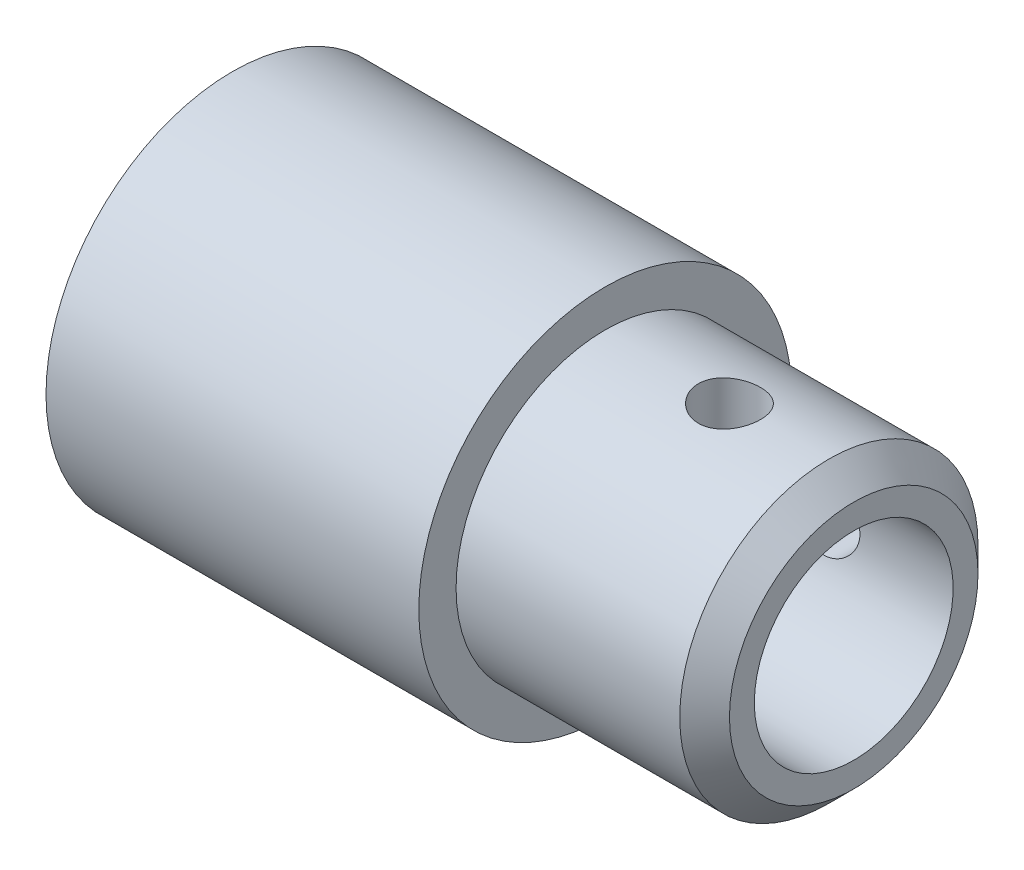
ISO-10303-21;
HEADER;
FILE_DESCRIPTION(('STEP AP214'),'2;1');
FILE_NAME('part.step','',(''),(''),'','','');
FILE_SCHEMA(('AUTOMOTIVE_DESIGN { 1 0 10303 214 1 1 1 1 }'));
ENDSEC;
DATA;
#1=APPLICATION_CONTEXT('core data for automotive mechanical design processes');
#2=APPLICATION_PROTOCOL_DEFINITION('international standard','automotive_design',2000,#1);
#3=PRODUCT_CONTEXT('',#1,'mechanical');
#4=PRODUCT('Part','Part','',(#3));
#5=PRODUCT_RELATED_PRODUCT_CATEGORY('part','',(#4));
#6=PRODUCT_DEFINITION_FORMATION('','',#4);
#7=PRODUCT_DEFINITION_CONTEXT('part definition',#1,'design');
#8=PRODUCT_DEFINITION('design','',#6,#7);
#9=PRODUCT_DEFINITION_SHAPE('','',#8);
#10=(LENGTH_UNIT() NAMED_UNIT(*) SI_UNIT(.MILLI.,.METRE.));
#11=(NAMED_UNIT(*) PLANE_ANGLE_UNIT() SI_UNIT($,.RADIAN.));
#12=(NAMED_UNIT(*) SI_UNIT($,.STERADIAN.) SOLID_ANGLE_UNIT());
#13=UNCERTAINTY_MEASURE_WITH_UNIT(LENGTH_MEASURE(1.E-05),#10,'distance_accuracy_value','');
#14=(GEOMETRIC_REPRESENTATION_CONTEXT(3) GLOBAL_UNCERTAINTY_ASSIGNED_CONTEXT((#13)) GLOBAL_UNIT_ASSIGNED_CONTEXT((#10,
#11,#12)) REPRESENTATION_CONTEXT('',''));
#15=CARTESIAN_POINT('',(0.,0.,0.));
#16=DIRECTION('',(0.,0.,1.));
#17=DIRECTION('',(1.,0.,0.));
#18=AXIS2_PLACEMENT_3D('',#15,#16,#17);
#19=CARTESIAN_POINT('',(0.,0.,0.));
#20=DIRECTION('',(-1.,0.,0.));
#21=DIRECTION('',(0.,0.,1.));
#22=AXIS2_PLACEMENT_3D('',#19,#20,#21);
#23=CYLINDRICAL_SURFACE('',#22,6.);
#24=CARTESIAN_POINT('',(24.,0.,0.));
#25=DIRECTION('',(-1.,0.,0.));
#26=DIRECTION('',(0.,0.,1.));
#27=AXIS2_PLACEMENT_3D('',#24,#25,#26);
#28=CIRCLE('',#27,6.);
#29=CARTESIAN_POINT('',(24.,0.,6.));
#30=VERTEX_POINT('',#29);
#31=EDGE_CURVE('E40',#30,#30,#28,.T.);
#32=ORIENTED_EDGE('',*,*,#31,.T.);
#33=EDGE_LOOP('',(#32));
#34=FACE_BOUND('',#33,.T.);
#35=CARTESIAN_POINT('',(20.,1.24999999999997,-5.86834729715276));
#36=CARTESIAN_POINT('',(19.930609384849,1.24999750877597,-5.86834869213646));
#37=CARTESIAN_POINT('',(19.8611880279848,1.24420229433945,-5.86959145924544));
#38=CARTESIAN_POINT('',(19.7243136826828,1.22119649233776,-5.87442015581798));
#39=CARTESIAN_POINT('',(19.6568622444936,1.20397715440339,-5.87800788138389));
#40=CARTESIAN_POINT('',(19.5259276271651,1.15868397507228,-5.88710292961931));
#41=CARTESIAN_POINT('',(19.4624404040082,1.1306214124893,-5.89260825706946));
#42=CARTESIAN_POINT('',(19.3410755003544,1.0644698860173,-5.90491581335742));
#43=CARTESIAN_POINT('',(19.28319759327,1.02638132735817,-5.91171798977623));
#44=CARTESIAN_POINT('',(19.1738046248465,0.940636399466058,-5.92596934661468));
#45=CARTESIAN_POINT('',(19.1223881063735,0.892855554869644,-5.93342614373039));
#46=CARTESIAN_POINT('',(19.0282389313519,0.789351223880613,-5.94807966802576));
#47=CARTESIAN_POINT('',(18.9855069117086,0.73362715545598,-5.95527637609915));
#48=CARTESIAN_POINT('',(18.9095541119171,0.615162052999567,-5.96868135118849));
#49=CARTESIAN_POINT('',(18.8764274735367,0.55235942820492,-5.97487958631243));
#50=CARTESIAN_POINT('',(18.8212339471402,0.421928551006699,-5.98550347343303));
#51=CARTESIAN_POINT('',(18.7991659348465,0.354300789950571,-5.98992930561223));
#52=CARTESIAN_POINT('',(18.7670242388825,0.217162904200482,-5.99645589892179));
#53=CARTESIAN_POINT('',(18.7567839828048,0.147693380916338,-5.99858891959926));
#54=CARTESIAN_POINT('',(18.748068304243,0.00799184883950599,-6.00040112580612));
#55=CARTESIAN_POINT('',(18.7495916558069,-0.0622400797368566,-6.0000805670369));
#56=CARTESIAN_POINT('',(18.7642346009568,-0.200326586199589,-5.99704658090511));
#57=CARTESIAN_POINT('',(18.7771747189581,-0.268201128726493,-5.99437018956584));
#58=CARTESIAN_POINT('',(18.8139986253313,-0.400793746289769,-5.98696720898885));
#59=CARTESIAN_POINT('',(18.8378828772031,-0.465511687511038,-5.98224053291904));
#60=CARTESIAN_POINT('',(18.8960800521255,-0.590460005384699,-5.97120767323923));
#61=CARTESIAN_POINT('',(18.9304622942097,-0.650657134981665,-5.96489104125346));
#62=CARTESIAN_POINT('',(19.0086280028404,-0.764493456510663,-5.95137300440188));
#63=CARTESIAN_POINT('',(19.0524126382061,-0.818131831816433,-5.94417148958324));
#64=CARTESIAN_POINT('',(19.1491216248911,-0.918394203276926,-5.92951700233276));
#65=CARTESIAN_POINT('',(19.2022030599819,-0.964866487494808,-5.92206184975925));
#66=CARTESIAN_POINT('',(19.3154820489948,-1.04827597240489,-5.90786872648995));
#67=CARTESIAN_POINT('',(19.3756797613872,-1.08521296069981,-5.9011307717716));
#68=CARTESIAN_POINT('',(19.5017122548288,-1.14856217138456,-5.88912998409155));
#69=CARTESIAN_POINT('',(19.5675606506934,-1.17494805489729,-5.88387085232125));
#70=CARTESIAN_POINT('',(19.7028916193694,-1.21623577538674,-5.8754760641036));
#71=CARTESIAN_POINT('',(19.7723736728081,-1.2311392488235,-5.87234010507182));
#72=CARTESIAN_POINT('',(19.9116197063189,-1.24880863867019,-5.86860783239132));
#73=CARTESIAN_POINT('',(19.981354584537,-1.25179442918,-5.86796551863474));
#74=CARTESIAN_POINT('',(20.1203258115401,-1.24613693439296,-5.86916952018703));
#75=CARTESIAN_POINT('',(20.1895621909023,-1.23749436857864,-5.87101568152623));
#76=CARTESIAN_POINT('',(20.3248205160581,-1.20901558325485,-5.87694538226166));
#77=CARTESIAN_POINT('',(20.3908686671788,-1.18929841376873,-5.88100511282997));
#78=CARTESIAN_POINT('',(20.5187239894416,-1.13935810860921,-5.8908833850312));
#79=CARTESIAN_POINT('',(20.5805307856504,-1.10913404556148,-5.89670208191057));
#80=CARTESIAN_POINT('',(20.6991064412162,-1.03854598181486,-5.90954501937191));
#81=CARTESIAN_POINT('',(20.7557922044662,-0.99804532735398,-5.91658506648323));
#82=CARTESIAN_POINT('',(20.8616432491551,-0.908234440569897,-5.93103483993907));
#83=CARTESIAN_POINT('',(20.9108076862392,-0.85892322050519,-5.93844460766531));
#84=CARTESIAN_POINT('',(21.0010627130972,-0.751900450843357,-5.95294924316736));
#85=CARTESIAN_POINT('',(21.0420040950264,-0.69406190761457,-5.9600367471991));
#86=CARTESIAN_POINT('',(21.113588752088,-0.57220010221638,-5.97296708772406));
#87=CARTESIAN_POINT('',(21.1442324822374,-0.508177113476903,-5.97880997920818));
#88=CARTESIAN_POINT('',(21.1941386793173,-0.376142117847941,-5.98856148270678));
#89=CARTESIAN_POINT('',(21.2134691655443,-0.308156710970217,-5.99248163136497));
#90=CARTESIAN_POINT('',(21.2404144040081,-0.169813400503495,-5.99799561410226));
#91=CARTESIAN_POINT('',(21.2480306935327,-0.0994558094617174,-5.99958975342889));
#92=CARTESIAN_POINT('',(21.2512676220485,0.0402133434703167,-6.00026408056941));
#93=CARTESIAN_POINT('',(21.2471118999947,0.109519592177899,-5.99939113754811));
#94=CARTESIAN_POINT('',(21.2274193613471,0.246422870373528,-5.99532874094472));
#95=CARTESIAN_POINT('',(21.2118827135932,0.314019925202678,-5.99213932172839));
#96=CARTESIAN_POINT('',(21.1699722053514,0.445431965492027,-5.98380460077544));
#97=CARTESIAN_POINT('',(21.1436273361469,0.509256550004498,-5.97866453407556));
#98=CARTESIAN_POINT('',(21.080877602268,0.631610567220716,-5.96697995347705));
#99=CARTESIAN_POINT('',(21.0444718616569,0.690139538279485,-5.96043531730246));
#100=CARTESIAN_POINT('',(20.9618903320067,0.801340321298234,-5.94651596786387));
#101=CARTESIAN_POINT('',(20.9155557119433,0.853892633615899,-5.93912880302851));
#102=CARTESIAN_POINT('',(20.8147554990029,0.950552741980358,-5.9244278681135));
#103=CARTESIAN_POINT('',(20.7602879700516,0.994658521571205,-5.91711411595369));
#104=CARTESIAN_POINT('',(20.6439908975666,1.07367451852764,-5.90329191643328));
#105=CARTESIAN_POINT('',(20.5820815885379,1.10846928126991,-5.89679406702551));
#106=CARTESIAN_POINT('',(20.4531748439167,1.16710627925303,-5.88547039658063));
#107=CARTESIAN_POINT('',(20.386181951547,1.19095816292457,-5.88064310352601));
#108=CARTESIAN_POINT('',(20.2658937184316,1.22256554131858,-5.87414004405196));
#109=CARTESIAN_POINT('',(20.2132704634069,1.23283449005668,-5.87198163591589));
#110=CARTESIAN_POINT('',(20.107104219479,1.24655254358401,-5.86908475266778));
#111=CARTESIAN_POINT('',(20.05356126769,1.25000192292738,-5.86834622039194));
#112=CARTESIAN_POINT('',(20.,1.24999999999997,-5.86834729715276));
#113=B_SPLINE_CURVE_WITH_KNOTS('',3,(#35,#36,#37,#38,#39,#40,#41,#42,#43,#44,#45,#46,#47,#48,
#49,#50,#51,#52,#53,#54,#55,#56,#57,#58,#59,#60,#61,#62,#63,#64,#65,#66,#67,#68,#69,#70,#71,#72,
#73,#74,#75,#76,#77,#78,#79,#80,#81,#82,#83,#84,#85,#86,#87,#88,#89,#90,#91,#92,#93,#94,#95,#96,
#97,#98,#99,#100,#101,#102,#103,#104,#105,#106,#107,#108,#109,#110,#111,#112),.UNSPECIFIED.,.T.,
.F.,(4,2,2,2,2,2,2,2,2,2,2,2,2,2,2,2,2,2,2,2,2,2,2,2,2,2,2,2,2,2,2,2,2,2,2,2,2,2,4),(0.,
0.207975654071266,0.416110792417466,0.624030014802723,0.831940834815785,1.04271333467884,
1.25350128663873,1.46629026266843,1.67905760106932,1.88879048859263,2.09850151896337,
2.3049734141646,2.51145405455869,2.71932871977947,2.92722924104258,3.13905862244911,
3.35089272191626,3.56325237332485,3.77558175387594,3.98397516009789,4.19235567296521,
4.3985378623192,4.60473825464028,4.81383917934648,5.02296356082183,5.2355945875334,
5.44821621759037,5.65954599648531,5.87084803959578,6.07816293922641,6.28547476332978,
6.49223410585097,6.69901145528169,6.90938318978569,7.11980508427531,7.33272651358119,
7.54545984571984,7.70599867585765,7.86653104261156),.UNSPECIFIED.);
#114=CARTESIAN_POINT('',(20.,1.24999999999997,-5.86834729715276));
#115=VERTEX_POINT('',#114);
#116=EDGE_CURVE('E113',#115,#115,#113,.T.);
#117=ORIENTED_EDGE('',*,*,#116,.T.);
#118=EDGE_LOOP('',(#117));
#119=FACE_BOUND('',#118,.T.);
#120=CARTESIAN_POINT('',(20.,5.86834729715275,1.24999999999999));
#121=CARTESIAN_POINT('',(19.930609384849,5.86834869213646,1.24999750877599));
#122=CARTESIAN_POINT('',(19.8611880279848,5.86959145924544,1.24420229433947));
#123=CARTESIAN_POINT('',(19.7243136826828,5.87442015581798,1.22119649233778));
#124=CARTESIAN_POINT('',(19.6568622444936,5.87800788138388,1.20397715440341));
#125=CARTESIAN_POINT('',(19.5259276271651,5.8871029296193,1.1586839750723));
#126=CARTESIAN_POINT('',(19.4624404040082,5.89260825706945,1.13062141248932));
#127=CARTESIAN_POINT('',(19.3410755003544,5.90491581335741,1.06446988601732));
#128=CARTESIAN_POINT('',(19.28319759327,5.91171798977622,1.02638132735819));
#129=CARTESIAN_POINT('',(19.1738046248465,5.92596934661468,0.940636399466079));
#130=CARTESIAN_POINT('',(19.1223881063735,5.93342614373039,0.892855554869665));
#131=CARTESIAN_POINT('',(19.0282389313519,5.94807966802575,0.789351223880634));
#132=CARTESIAN_POINT('',(18.9855069117086,5.95527637609915,0.733627155456001));
#133=CARTESIAN_POINT('',(18.9095541119171,5.96868135118848,0.615162052999588));
#134=CARTESIAN_POINT('',(18.8764274735367,5.97487958631242,0.552359428204941));
#135=CARTESIAN_POINT('',(18.8212339471402,5.98550347343302,0.42192855100672));
#136=CARTESIAN_POINT('',(18.7991659348465,5.98992930561222,0.354300789950591));
#137=CARTESIAN_POINT('',(18.7670242388825,5.99645589892179,0.217162904200503));
#138=CARTESIAN_POINT('',(18.7567839828048,5.99858891959926,0.147693380916359));
#139=CARTESIAN_POINT('',(18.748068304243,6.00040112580612,0.00799184883952699));
#140=CARTESIAN_POINT('',(18.7495916558069,6.0000805670369,-0.0622400797368356));
#141=CARTESIAN_POINT('',(18.7642346009568,5.99704658090511,-0.200326586199568));
#142=CARTESIAN_POINT('',(18.7771747189581,5.99437018956584,-0.268201128726472));
#143=CARTESIAN_POINT('',(18.8139986253313,5.98696720898885,-0.400793746289748));
#144=CARTESIAN_POINT('',(18.8378828772031,5.98224053291904,-0.465511687511017));
#145=CARTESIAN_POINT('',(18.8960800521255,5.97120767323924,-0.590460005384678));
#146=CARTESIAN_POINT('',(18.9304622942097,5.96489104125346,-0.650657134981644));
#147=CARTESIAN_POINT('',(19.0086280028404,5.95137300440189,-0.764493456510642));
#148=CARTESIAN_POINT('',(19.0524126382061,5.94417148958325,-0.818131831816412));
#149=CARTESIAN_POINT('',(19.1491216248911,5.92951700233276,-0.918394203276905));
#150=CARTESIAN_POINT('',(19.2022030599819,5.92206184975926,-0.964866487494787));
#151=CARTESIAN_POINT('',(19.3154820489948,5.90786872648996,-1.04827597240487));
#152=CARTESIAN_POINT('',(19.3756797613872,5.9011307717716,-1.08521296069979));
#153=CARTESIAN_POINT('',(19.5017122548288,5.88912998409156,-1.14856217138453));
#154=CARTESIAN_POINT('',(19.5675606506934,5.88387085232125,-1.17494805489726));
#155=CARTESIAN_POINT('',(19.7028916193694,5.8754760641036,-1.21623577538672));
#156=CARTESIAN_POINT('',(19.7723736728081,5.87234010507182,-1.23113924882348));
#157=CARTESIAN_POINT('',(19.9116197063189,5.86860783239132,-1.24880863867017));
#158=CARTESIAN_POINT('',(19.981354584537,5.86796551863474,-1.25179442917998));
#159=CARTESIAN_POINT('',(20.1203258115401,5.86916952018704,-1.24613693439294));
#160=CARTESIAN_POINT('',(20.1895621909023,5.87101568152624,-1.23749436857862));
#161=CARTESIAN_POINT('',(20.3248205160581,5.87694538226167,-1.20901558325483));
#162=CARTESIAN_POINT('',(20.3908686671788,5.88100511282998,-1.18929841376871));
#163=CARTESIAN_POINT('',(20.5187239894416,5.8908833850312,-1.13935810860919));
#164=CARTESIAN_POINT('',(20.5805307856504,5.89670208191057,-1.10913404556146));
#165=CARTESIAN_POINT('',(20.6991064412162,5.90954501937191,-1.03854598181484));
#166=CARTESIAN_POINT('',(20.7557922044662,5.91658506648323,-0.998045327353959));
#167=CARTESIAN_POINT('',(20.8616432491551,5.93103483993908,-0.908234440569876));
#168=CARTESIAN_POINT('',(20.9108076862392,5.93844460766532,-0.85892322050517));
#169=CARTESIAN_POINT('',(21.0010627130972,5.95294924316736,-0.751900450843337));
#170=CARTESIAN_POINT('',(21.0420040950264,5.9600367471991,-0.694061907614549));
#171=CARTESIAN_POINT('',(21.113588752088,5.97296708772407,-0.572200102216359));
#172=CARTESIAN_POINT('',(21.1442324822374,5.97880997920818,-0.508177113476882));
#173=CARTESIAN_POINT('',(21.1941386793173,5.98856148270679,-0.376142117847921));
#174=CARTESIAN_POINT('',(21.2134691655443,5.99248163136497,-0.308156710970196));
#175=CARTESIAN_POINT('',(21.2404144040081,5.99799561410226,-0.169813400503474));
#176=CARTESIAN_POINT('',(21.2480306935327,5.99958975342889,-0.0994558094616964));
#177=CARTESIAN_POINT('',(21.2512676220485,6.00026408056941,0.0402133434703376));
#178=CARTESIAN_POINT('',(21.2471118999947,5.99939113754811,0.10951959217792));
#179=CARTESIAN_POINT('',(21.2274193613471,5.99532874094472,0.246422870373549));
#180=CARTESIAN_POINT('',(21.2118827135932,5.99213932172839,0.314019925202699));
#181=CARTESIAN_POINT('',(21.1699722053514,5.98380460077544,0.445431965492047));
#182=CARTESIAN_POINT('',(21.1436273361469,5.97866453407556,0.509256550004518));
#183=CARTESIAN_POINT('',(21.080877602268,5.96697995347704,0.631610567220735));
#184=CARTESIAN_POINT('',(21.0444718616569,5.96043531730246,0.690139538279505));
#185=CARTESIAN_POINT('',(20.9618903320067,5.94651596786386,0.801340321298254));
#186=CARTESIAN_POINT('',(20.9155557119433,5.93912880302851,0.85389263361592));
#187=CARTESIAN_POINT('',(20.8147554990029,5.9244278681135,0.950552741980379));
#188=CARTESIAN_POINT('',(20.7602879700516,5.91711411595368,0.994658521571226));
#189=CARTESIAN_POINT('',(20.6439908975666,5.90329191643327,1.07367451852767));
#190=CARTESIAN_POINT('',(20.5820815885379,5.89679406702551,1.10846928126993));
#191=CARTESIAN_POINT('',(20.4531748439167,5.88547039658063,1.16710627925306));
#192=CARTESIAN_POINT('',(20.386181951547,5.88064310352601,1.19095816292459));
#193=CARTESIAN_POINT('',(20.2658937184316,5.87414004405196,1.2225655413186));
#194=CARTESIAN_POINT('',(20.2132704634069,5.87198163591589,1.23283449005669));
#195=CARTESIAN_POINT('',(20.107104219479,5.86908475266778,1.24655254358403));
#196=CARTESIAN_POINT('',(20.05356126769,5.86834622039193,1.2500019229274));
#197=CARTESIAN_POINT('',(20.,5.86834729715275,1.24999999999999));
#198=B_SPLINE_CURVE_WITH_KNOTS('',3,(#120,#121,#122,#123,#124,#125,#126,#127,#128,#129,#130,
#131,#132,#133,#134,#135,#136,#137,#138,#139,#140,#141,#142,#143,#144,#145,#146,#147,#148,#149,
#150,#151,#152,#153,#154,#155,#156,#157,#158,#159,#160,#161,#162,#163,#164,#165,#166,#167,#168,
#169,#170,#171,#172,#173,#174,#175,#176,#177,#178,#179,#180,#181,#182,#183,#184,#185,#186,#187,
#188,#189,#190,#191,#192,#193,#194,#195,#196,#197),.UNSPECIFIED.,.T.,.F.,(4,2,2,2,2,2,2,2,2,2,2,
2,2,2,2,2,2,2,2,2,2,2,2,2,2,2,2,2,2,2,2,2,2,2,2,2,2,2,4),(0.,0.207975654071266,
0.416110792417466,0.624030014802731,0.831940834815785,1.04271333467884,1.25350128663873,
1.46629026266843,1.67905760106932,1.88879048859263,2.09850151896337,2.3049734141646,
2.51145405455869,2.71932871977947,2.92722924104258,3.13905862244911,3.35089272191626,
3.56325237332485,3.77558175387594,3.98397516009789,4.19235567296521,4.3985378623192,
4.60473825464028,4.81383917934648,5.02296356082183,5.2355945875334,5.44821621759037,
5.65954599648531,5.87084803959578,6.07816293922641,6.28547476332978,6.49223410585097,
6.69901145528169,6.90938318978569,7.11980508427531,7.33272651358119,7.54545984571984,
7.70599867585765,7.86653104261156),.UNSPECIFIED.);
#199=CARTESIAN_POINT('',(20.,5.86834729715275,1.24999999999999));
#200=VERTEX_POINT('',#199);
#201=EDGE_CURVE('E62',#200,#200,#198,.T.);
#202=ORIENTED_EDGE('',*,*,#201,.T.);
#203=EDGE_LOOP('',(#202));
#204=FACE_BOUND('',#203,.T.);
#205=CARTESIAN_POINT('',(15.,0.,0.));
#206=DIRECTION('',(-1.,0.,0.));
#207=DIRECTION('',(0.,0.,1.));
#208=AXIS2_PLACEMENT_3D('',#205,#206,#207);
#209=CIRCLE('',#208,6.);
#210=CARTESIAN_POINT('',(15.,0.,6.));
#211=VERTEX_POINT('',#210);
#212=EDGE_CURVE('E44',#211,#211,#209,.T.);
#213=ORIENTED_EDGE('',*,*,#212,.F.);
#214=EDGE_LOOP('',(#213));
#215=FACE_BOUND('',#214,.T.);
#216=ADVANCED_FACE('F33',(#34,#119,#204,#215),#23,.T.);
#217=CARTESIAN_POINT('',(0.,0.,0.));
#218=DIRECTION('',(-1.,0.,0.));
#219=DIRECTION('',(0.,0.,1.));
#220=AXIS2_PLACEMENT_3D('',#217,#218,#219);
#221=CYLINDRICAL_SURFACE('',#220,4.);
#222=CARTESIAN_POINT('',(20.,1.24999999999998,-3.79967103839267));
#223=CARTESIAN_POINT('',(20.0683470361093,1.24999953780045,-3.79967145961937));
#224=CARTESIAN_POINT('',(20.1366987687032,1.24437538791492,-3.80153531505043));
#225=CARTESIAN_POINT('',(20.2713941608778,1.22209175401325,-3.80875638998877));
#226=CARTESIAN_POINT('',(20.3377372727322,1.20542928782513,-3.81411455353137));
#227=CARTESIAN_POINT('',(20.466444901932,1.16169788223557,-3.8276593883596));
#228=CARTESIAN_POINT('',(20.5288162331057,1.13464735736675,-3.83584105194317));
#229=CARTESIAN_POINT('',(20.648152695864,1.07096914173155,-3.85410406218689));
#230=CARTESIAN_POINT('',(20.7051168699601,1.0343397590563,-3.86418574435841));
#231=CARTESIAN_POINT('',(20.8139788674935,0.951196070622273,-3.8855012766862));
#232=CARTESIAN_POINT('',(20.865663609436,0.904409399720379,-3.89676123384781));
#233=CARTESIAN_POINT('',(20.9605960132092,0.802862046455476,-3.91894245860336));
#234=CARTESIAN_POINT('',(21.0038424969448,0.748100252518547,-3.92986367872628));
#235=CARTESIAN_POINT('',(21.0816110630112,0.630625912493345,-3.95043553390078));
#236=CARTESIAN_POINT('',(21.1159137038314,0.567761556520078,-3.9600518456278));
#237=CARTESIAN_POINT('',(21.1733760498555,0.436804232853388,-3.97662551833019));
#238=CARTESIAN_POINT('',(21.1965383741496,0.368712498487036,-3.98358350419919));
#239=CARTESIAN_POINT('',(21.2303511280971,0.231464356966083,-3.99387175820863));
#240=CARTESIAN_POINT('',(21.2413657497878,0.162405715468201,-3.99730738984143));
#241=CARTESIAN_POINT('',(21.2517243464375,0.0233408139845071,-4.00053595876015));
#242=CARTESIAN_POINT('',(21.2510709743588,-0.0466652269730961,-4.00032972410065));
#243=CARTESIAN_POINT('',(21.238351708414,-0.183074480354746,-3.99637116132537));
#244=CARTESIAN_POINT('',(21.226680616487,-0.249518634314055,-3.99274150972157));
#245=CARTESIAN_POINT('',(21.192905009957,-0.379453063347781,-3.98249482560855));
#246=CARTESIAN_POINT('',(21.1707998149134,-0.442943145481206,-3.97587759827134));
#247=CARTESIAN_POINT('',(21.1165298109251,-0.566078103154791,-3.96023459729533));
#248=CARTESIAN_POINT('',(21.084245191437,-0.62566640562284,-3.95118033616957));
#249=CARTESIAN_POINT('',(21.0106289002954,-0.738702511152038,-3.93161722953562));
#250=CARTESIAN_POINT('',(20.9692949408622,-0.792148756208846,-3.92110801644584));
#251=CARTESIAN_POINT('',(20.8767263651987,-0.89373769845389,-3.89923670734646));
#252=CARTESIAN_POINT('',(20.8251509311588,-0.941566549094187,-3.88785731989084));
#253=CARTESIAN_POINT('',(20.7146048981755,-1.02798974259538,-3.86590615440412));
#254=CARTESIAN_POINT('',(20.655633429425,-1.06658299775342,-3.85533447159846));
#255=CARTESIAN_POINT('',(20.5310825311402,-1.13380465019766,-3.83610846648973));
#256=CARTESIAN_POINT('',(20.4654365909576,-1.16231680702683,-3.82747690354323));
#257=CARTESIAN_POINT('',(20.3299405081046,-1.20778345948514,-3.81337545338913));
#258=CARTESIAN_POINT('',(20.2600918857895,-1.22474210765794,-3.80790443033293));
#259=CARTESIAN_POINT('',(20.1211800474342,-1.24601485185709,-3.80099563391872));
#260=CARTESIAN_POINT('',(20.0521980037679,-1.25080954353711,-3.79940466389696));
#261=CARTESIAN_POINT('',(19.9144102585018,-1.24896744498308,-3.80001077463984));
#262=CARTESIAN_POINT('',(19.8456045312995,-1.24233242111456,-3.80220727008389));
#263=CARTESIAN_POINT('',(19.7121917033484,-1.21824873513144,-3.80998957482874));
#264=CARTESIAN_POINT('',(19.647520725926,-1.20111831160538,-3.81547554101731));
#265=CARTESIAN_POINT('',(19.521978208004,-1.15690373661028,-3.8291128733166));
#266=CARTESIAN_POINT('',(19.4611072890788,-1.12981796171155,-3.83726467412387));
#267=CARTESIAN_POINT('',(19.3429608902283,-1.06557510655875,-3.85560539653156));
#268=CARTESIAN_POINT('',(19.2858385844072,-1.02815147488558,-3.86584603489733));
#269=CARTESIAN_POINT('',(19.1785096536381,-0.944606408679819,-3.88710348972828));
#270=CARTESIAN_POINT('',(19.1283048310747,-0.898482714690792,-3.89812050735702));
#271=CARTESIAN_POINT('',(19.0340896340872,-0.796572947753613,-3.92024187562679));
#272=CARTESIAN_POINT('',(18.9904222138601,-0.740465649788529,-3.93133092285679));
#273=CARTESIAN_POINT('',(18.9131089566788,-0.621451545651407,-3.95189059843678));
#274=CARTESIAN_POINT('',(18.879462660689,-0.558545051108634,-3.96136130090946));
#275=CARTESIAN_POINT('',(18.8234694375283,-0.428105523331845,-3.97756311928512));
#276=CARTESIAN_POINT('',(18.8010407121563,-0.36061018428377,-3.984313995612));
#277=CARTESIAN_POINT('',(18.7679274614103,-0.222557254056404,-3.99440242648576));
#278=CARTESIAN_POINT('',(18.7572392609165,-0.152000628340371,-3.99774104914277));
#279=CARTESIAN_POINT('',(18.7482089982504,-0.0129849366489144,-4.00055803404462));
#280=CARTESIAN_POINT('',(18.7493715498292,0.0554391919465063,-4.0001912940739));
#281=CARTESIAN_POINT('',(18.7628118110487,0.191073221923232,-3.99600978081048));
#282=CARTESIAN_POINT('',(18.775088795992,0.258283202179552,-3.99219523232619));
#283=CARTESIAN_POINT('',(18.8100940092223,0.388755118480775,-3.98159570844796));
#284=CARTESIAN_POINT('',(18.8326896078454,0.452055918449464,-3.97484847960205));
#285=CARTESIAN_POINT('',(18.8875708272085,0.573998425500073,-3.9590794558795));
#286=CARTESIAN_POINT('',(18.9198581099734,0.632639331274464,-3.95005727091358));
#287=CARTESIAN_POINT('',(18.9944727583444,0.74576169496967,-3.93029896883376));
#288=CARTESIAN_POINT('',(19.037103522464,0.800034607053092,-3.91951509750962));
#289=CARTESIAN_POINT('',(19.1306598894435,0.900820791399299,-3.89758736547061));
#290=CARTESIAN_POINT('',(19.1815879741394,0.94733173350414,-3.88644339784827));
#291=CARTESIAN_POINT('',(19.2923157198411,1.03282865911251,-3.86461892577438));
#292=CARTESIAN_POINT('',(19.3523534031166,1.07151427994709,-3.85396600863456));
#293=CARTESIAN_POINT('',(19.4783981202691,1.1382047074852,-3.83480125279531));
#294=CARTESIAN_POINT('',(19.5444027264503,1.16621383403544,-3.82628854861387));
#295=CARTESIAN_POINT('',(19.6747226173147,1.2087118043579,-3.81306560440328));
#296=CARTESIAN_POINT('',(19.7387025474516,1.22414939837871,-3.8080931504375));
#297=CARTESIAN_POINT('',(19.8684538320965,1.24479245816098,-3.80139606482399));
#298=CARTESIAN_POINT('',(19.9342247412015,1.25000044480776,-3.79967063301599));
#299=CARTESIAN_POINT('',(20.,1.24999999999998,-3.79967103839267));
#300=B_SPLINE_CURVE_WITH_KNOTS('',3,(#222,#223,#224,#225,#226,#227,#228,#229,#230,#231,#232,
#233,#234,#235,#236,#237,#238,#239,#240,#241,#242,#243,#244,#245,#246,#247,#248,#249,#250,#251,
#252,#253,#254,#255,#256,#257,#258,#259,#260,#261,#262,#263,#264,#265,#266,#267,#268,#269,#270,
#271,#272,#273,#274,#275,#276,#277,#278,#279,#280,#281,#282,#283,#284,#285,#286,#287,#288,#289,
#290,#291,#292,#293,#294,#295,#296,#297,#298,#299),.UNSPECIFIED.,.T.,.F.,(4,2,2,2,2,2,2,2,2,2,2,
2,2,2,2,2,2,2,2,2,2,2,2,2,2,2,2,2,2,2,2,2,2,2,2,2,2,2,4),(0.,0.204798137548487,
0.409651627059732,0.614143644118576,0.818671804924944,1.02957080550838,1.24049922941122,
1.45619821963732,1.67184647417921,1.88083722835532,2.08978046471773,2.29150982969749,
2.49325235190092,2.69746404608407,2.90172742713186,3.11450338937332,3.32730439853774,
3.54248470934452,3.75758763952751,3.96404933287933,4.17047912219087,4.37093972044361,
4.57143302253207,4.77767613309608,4.98397288011877,5.19881937811508,5.41365603317083,
5.62690239290994,5.84008198140581,6.04438802439521,6.24868074692303,6.45041846514755,
6.65219079911648,6.86080693105211,7.06948557772186,7.285077955017,7.50058300803817,
7.69772354371381,7.89481549188774),.UNSPECIFIED.);
#301=CARTESIAN_POINT('',(20.,1.24999999999998,-3.79967103839267));
#302=VERTEX_POINT('',#301);
#303=EDGE_CURVE('E120',#302,#302,#300,.T.);
#304=ORIENTED_EDGE('',*,*,#303,.T.);
#305=EDGE_LOOP('',(#304));
#306=FACE_BOUND('',#305,.T.);
#307=CARTESIAN_POINT('',(20.,3.79967103839267,1.24999999999999));
#308=CARTESIAN_POINT('',(20.0683470361093,3.79967145961936,1.24999953780046));
#309=CARTESIAN_POINT('',(20.1366987687032,3.80153531505043,1.24437538791494));
#310=CARTESIAN_POINT('',(20.2713941608778,3.80875638998877,1.22209175401326));
#311=CARTESIAN_POINT('',(20.3377372727322,3.81411455353136,1.20542928782514));
#312=CARTESIAN_POINT('',(20.466444901932,3.8276593883596,1.16169788223558));
#313=CARTESIAN_POINT('',(20.5288162331057,3.83584105194317,1.13464735736676));
#314=CARTESIAN_POINT('',(20.648152695864,3.85410406218688,1.07096914173156));
#315=CARTESIAN_POINT('',(20.7051168699601,3.86418574435841,1.03433975905631));
#316=CARTESIAN_POINT('',(20.8139788674935,3.8855012766862,0.951196070622286));
#317=CARTESIAN_POINT('',(20.865663609436,3.8967612338478,0.904409399720393));
#318=CARTESIAN_POINT('',(20.9605960132092,3.91894245860336,0.80286204645549));
#319=CARTESIAN_POINT('',(21.0038424969448,3.92986367872627,0.748100252518561));
#320=CARTESIAN_POINT('',(21.0816110630112,3.95043553390078,0.630625912493359));
#321=CARTESIAN_POINT('',(21.1159137038314,3.9600518456278,0.567761556520092));
#322=CARTESIAN_POINT('',(21.1733760498555,3.97662551833019,0.436804232853402));
#323=CARTESIAN_POINT('',(21.1965383741496,3.98358350419919,0.36871249848705));
#324=CARTESIAN_POINT('',(21.2303511280971,3.99387175820862,0.231464356966097));
#325=CARTESIAN_POINT('',(21.2413657497878,3.99730738984143,0.162405715468215));
#326=CARTESIAN_POINT('',(21.2517243464375,4.00053595876015,0.0233408139845211));
#327=CARTESIAN_POINT('',(21.2510709743588,4.00032972410065,-0.0466652269730821));
#328=CARTESIAN_POINT('',(21.238351708414,3.99637116132537,-0.183074480354732));
#329=CARTESIAN_POINT('',(21.226680616487,3.99274150972157,-0.249518634314041));
#330=CARTESIAN_POINT('',(21.192905009957,3.98249482560855,-0.379453063347767));
#331=CARTESIAN_POINT('',(21.1707998149134,3.97587759827134,-0.442943145481192));
#332=CARTESIAN_POINT('',(21.1165298109251,3.96023459729533,-0.566078103154777));
#333=CARTESIAN_POINT('',(21.084245191437,3.95118033616957,-0.625666405622826));
#334=CARTESIAN_POINT('',(21.0106289002954,3.93161722953562,-0.738702511152024));
#335=CARTESIAN_POINT('',(20.9692949408622,3.92110801644584,-0.792148756208833));
#336=CARTESIAN_POINT('',(20.8767263651987,3.89923670734646,-0.893737698453876));
#337=CARTESIAN_POINT('',(20.8251509311588,3.88785731989084,-0.941566549094174));
#338=CARTESIAN_POINT('',(20.7146048981755,3.86590615440413,-1.02798974259537));
#339=CARTESIAN_POINT('',(20.655633429425,3.85533447159847,-1.06658299775341));
#340=CARTESIAN_POINT('',(20.5310825311402,3.83610846648974,-1.13380465019765));
#341=CARTESIAN_POINT('',(20.4654365909576,3.82747690354324,-1.16231680702681));
#342=CARTESIAN_POINT('',(20.3299405081046,3.81337545338913,-1.20778345948513));
#343=CARTESIAN_POINT('',(20.2600918857895,3.80790443033294,-1.22474210765793));
#344=CARTESIAN_POINT('',(20.1211800474342,3.80099563391872,-1.24601485185708));
#345=CARTESIAN_POINT('',(20.0521980037679,3.79940466389696,-1.2508095435371));
#346=CARTESIAN_POINT('',(19.9144102585018,3.80001077463985,-1.24896744498306));
#347=CARTESIAN_POINT('',(19.8456045312995,3.8022072700839,-1.24233242111455));
#348=CARTESIAN_POINT('',(19.7121917033484,3.80998957482874,-1.21824873513143));
#349=CARTESIAN_POINT('',(19.647520725926,3.81547554101732,-1.20111831160537));
#350=CARTESIAN_POINT('',(19.521978208004,3.82911287331661,-1.15690373661027));
#351=CARTESIAN_POINT('',(19.4611072890788,3.83726467412388,-1.12981796171154));
#352=CARTESIAN_POINT('',(19.3429608902283,3.85560539653156,-1.06557510655874));
#353=CARTESIAN_POINT('',(19.2858385844072,3.86584603489733,-1.02815147488557));
#354=CARTESIAN_POINT('',(19.1785096536381,3.88710348972828,-0.944606408679805));
#355=CARTESIAN_POINT('',(19.1283048310747,3.89812050735703,-0.898482714690778));
#356=CARTESIAN_POINT('',(19.0340896340872,3.92024187562679,-0.7965729477536));
#357=CARTESIAN_POINT('',(18.9904222138601,3.93133092285679,-0.740465649788515));
#358=CARTESIAN_POINT('',(18.9131089566788,3.95189059843678,-0.621451545651393));
#359=CARTESIAN_POINT('',(18.879462660689,3.96136130090946,-0.558545051108621));
#360=CARTESIAN_POINT('',(18.8234694375283,3.97756311928512,-0.428105523331831));
#361=CARTESIAN_POINT('',(18.8010407121563,3.984313995612,-0.360610184283756));
#362=CARTESIAN_POINT('',(18.7679274614103,3.99440242648576,-0.22255725405639));
#363=CARTESIAN_POINT('',(18.7572392609165,3.99774104914277,-0.152000628340357));
#364=CARTESIAN_POINT('',(18.7482089982504,4.00055803404461,-0.0129849366489005));
#365=CARTESIAN_POINT('',(18.7493715498292,4.0001912940739,0.0554391919465202));
#366=CARTESIAN_POINT('',(18.7628118110487,3.99600978081048,0.191073221923246));
#367=CARTESIAN_POINT('',(18.775088795992,3.99219523232619,0.258283202179566));
#368=CARTESIAN_POINT('',(18.8100940092223,3.98159570844796,0.388755118480788));
#369=CARTESIAN_POINT('',(18.8326896078454,3.97484847960205,0.452055918449478));
#370=CARTESIAN_POINT('',(18.8875708272085,3.9590794558795,0.573998425500087));
#371=CARTESIAN_POINT('',(18.9198581099734,3.95005727091358,0.632639331274477));
#372=CARTESIAN_POINT('',(18.9944727583444,3.93029896883376,0.745761694969684));
#373=CARTESIAN_POINT('',(19.037103522464,3.91951509750962,0.800034607053106));
#374=CARTESIAN_POINT('',(19.1306598894435,3.89758736547061,0.900820791399313));
#375=CARTESIAN_POINT('',(19.1815879741394,3.88644339784827,0.947331733504153));
#376=CARTESIAN_POINT('',(19.2923157198411,3.86461892577438,1.03282865911252));
#377=CARTESIAN_POINT('',(19.3523534031166,3.85396600863456,1.0715142799471));
#378=CARTESIAN_POINT('',(19.4783981202691,3.83480125279531,1.13820470748521));
#379=CARTESIAN_POINT('',(19.5444027264503,3.82628854861387,1.16621383403545));
#380=CARTESIAN_POINT('',(19.6747226173147,3.81306560440328,1.20871180435792));
#381=CARTESIAN_POINT('',(19.7387025474516,3.80809315043749,1.22414939837873));
#382=CARTESIAN_POINT('',(19.8684538320965,3.80139606482399,1.24479245816099));
#383=CARTESIAN_POINT('',(19.9342247412015,3.79967063301598,1.25000044480778));
#384=CARTESIAN_POINT('',(20.,3.79967103839267,1.24999999999999));
#385=B_SPLINE_CURVE_WITH_KNOTS('',3,(#307,#308,#309,#310,#311,#312,#313,#314,#315,#316,#317,
#318,#319,#320,#321,#322,#323,#324,#325,#326,#327,#328,#329,#330,#331,#332,#333,#334,#335,#336,
#337,#338,#339,#340,#341,#342,#343,#344,#345,#346,#347,#348,#349,#350,#351,#352,#353,#354,#355,
#356,#357,#358,#359,#360,#361,#362,#363,#364,#365,#366,#367,#368,#369,#370,#371,#372,#373,#374,
#375,#376,#377,#378,#379,#380,#381,#382,#383,#384),.UNSPECIFIED.,.T.,.F.,(4,2,2,2,2,2,2,2,2,2,2,
2,2,2,2,2,2,2,2,2,2,2,2,2,2,2,2,2,2,2,2,2,2,2,2,2,2,2,4),(0.,0.204798137548487,
0.409651627059732,0.614143644118575,0.818671804924945,1.02957080550838,1.24049922941122,
1.45619821963732,1.67184647417921,1.88083722835532,2.08978046471773,2.29150982969749,
2.49325235190092,2.69746404608407,2.90172742713186,3.11450338937332,3.32730439853774,
3.54248470934452,3.75758763952751,3.96404933287933,4.17047912219087,4.37093972044361,
4.57143302253207,4.77767613309608,4.98397288011877,5.19881937811508,5.41365603317083,
5.62690239290994,5.84008198140581,6.04438802439521,6.24868074692303,6.45041846514755,
6.65219079911648,6.86080693105211,7.06948557772186,7.285077955017,7.50058300803817,
7.69772354371381,7.89481549188774),.UNSPECIFIED.);
#386=CARTESIAN_POINT('',(20.,3.79967103839267,1.24999999999999));
#387=VERTEX_POINT('',#386);
#388=EDGE_CURVE('E69',#387,#387,#385,.T.);
#389=ORIENTED_EDGE('',*,*,#388,.T.);
#390=EDGE_LOOP('',(#389));
#391=FACE_BOUND('',#390,.T.);
#392=CARTESIAN_POINT('',(0.,0.,0.));
#393=DIRECTION('',(-1.,0.,0.));
#394=DIRECTION('',(0.,0.,1.));
#395=AXIS2_PLACEMENT_3D('',#392,#393,#394);
#396=CIRCLE('',#395,4.);
#397=CARTESIAN_POINT('',(0.,0.,4.));
#398=VERTEX_POINT('',#397);
#399=EDGE_CURVE('E48',#398,#398,#396,.T.);
#400=ORIENTED_EDGE('',*,*,#399,.T.);
#401=EDGE_LOOP('',(#400));
#402=FACE_BOUND('',#401,.T.);
#403=CARTESIAN_POINT('',(25.,0.,0.));
#404=DIRECTION('',(-1.,0.,0.));
#405=DIRECTION('',(0.,0.,1.));
#406=AXIS2_PLACEMENT_3D('',#403,#404,#405);
#407=CIRCLE('',#406,4.);
#408=CARTESIAN_POINT('',(25.,0.,4.));
#409=VERTEX_POINT('',#408);
#410=EDGE_CURVE('E53',#409,#409,#407,.T.);
#411=ORIENTED_EDGE('',*,*,#410,.F.);
#412=EDGE_LOOP('',(#411));
#413=FACE_BOUND('',#412,.T.);
#414=ADVANCED_FACE('F101',(#306,#391,#402,#413),#221,.F.);
#415=CARTESIAN_POINT('',(0.,4.,0.));
#416=DIRECTION('',(1.,0.,0.));
#417=DIRECTION('',(0.,0.,-1.));
#418=AXIS2_PLACEMENT_3D('',#415,#416,#417);
#419=PLANE('',#418);
#420=ORIENTED_EDGE('',*,*,#399,.F.);
#421=EDGE_LOOP('',(#420));
#422=FACE_BOUND('',#421,.T.);
#423=CARTESIAN_POINT('',(0.,0.,0.));
#424=DIRECTION('',(-1.,0.,0.));
#425=DIRECTION('',(0.,0.,1.));
#426=AXIS2_PLACEMENT_3D('',#423,#424,#425);
#427=CIRCLE('',#426,7.5);
#428=CARTESIAN_POINT('',(0.,0.,7.5));
#429=VERTEX_POINT('',#428);
#430=EDGE_CURVE('E56',#429,#429,#427,.T.);
#431=ORIENTED_EDGE('',*,*,#430,.T.);
#432=EDGE_LOOP('',(#431));
#433=FACE_BOUND('',#432,.T.);
#434=ADVANCED_FACE('F97',(#422,#433),#419,.F.);
#435=CARTESIAN_POINT('',(25.,6.,0.));
#436=DIRECTION('',(-1.,0.,0.));
#437=DIRECTION('',(0.,0.,1.));
#438=AXIS2_PLACEMENT_3D('',#435,#436,#437);
#439=PLANE('',#438);
#440=CARTESIAN_POINT('',(25.,0.,0.));
#441=DIRECTION('',(-1.,0.,0.));
#442=DIRECTION('',(0.,0.,1.));
#443=AXIS2_PLACEMENT_3D('',#440,#441,#442);
#444=CIRCLE('',#443,4.99999999999999);
#445=CARTESIAN_POINT('',(25.,0.,4.99999999999999));
#446=VERTEX_POINT('',#445);
#447=EDGE_CURVE('E10',#446,#446,#444,.F.);
#448=ORIENTED_EDGE('',*,*,#447,.T.);
#449=EDGE_LOOP('',(#448));
#450=FACE_BOUND('',#449,.T.);
#451=ORIENTED_EDGE('',*,*,#410,.T.);
#452=EDGE_LOOP('',(#451));
#453=FACE_BOUND('',#452,.T.);
#454=ADVANCED_FACE('F92',(#450,#453),#439,.F.);
#455=CARTESIAN_POINT('',(15.,4.,0.));
#456=DIRECTION('',(-1.,0.,0.));
#457=DIRECTION('',(0.,0.,1.));
#458=AXIS2_PLACEMENT_3D('',#455,#456,#457);
#459=PLANE('',#458);
#460=CARTESIAN_POINT('',(15.,0.,0.));
#461=DIRECTION('',(-1.,0.,0.));
#462=DIRECTION('',(0.,0.,1.));
#463=AXIS2_PLACEMENT_3D('',#460,#461,#462);
#464=CIRCLE('',#463,7.5);
#465=CARTESIAN_POINT('',(15.,0.,7.5));
#466=VERTEX_POINT('',#465);
#467=EDGE_CURVE('E59',#466,#466,#464,.T.);
#468=ORIENTED_EDGE('',*,*,#467,.F.);
#469=EDGE_LOOP('',(#468));
#470=FACE_BOUND('',#469,.T.);
#471=ORIENTED_EDGE('',*,*,#212,.T.);
#472=EDGE_LOOP('',(#471));
#473=FACE_BOUND('',#472,.T.);
#474=ADVANCED_FACE('F89',(#470,#473),#459,.F.);
#475=CARTESIAN_POINT('',(0.,0.,0.));
#476=DIRECTION('',(-1.,0.,0.));
#477=DIRECTION('',(0.,0.,1.));
#478=AXIS2_PLACEMENT_3D('',#475,#476,#477);
#479=CYLINDRICAL_SURFACE('',#478,7.5);
#480=ORIENTED_EDGE('',*,*,#430,.F.);
#481=EDGE_LOOP('',(#480));
#482=FACE_BOUND('',#481,.T.);
#483=ORIENTED_EDGE('',*,*,#467,.T.);
#484=EDGE_LOOP('',(#483));
#485=FACE_BOUND('',#484,.T.);
#486=ADVANCED_FACE('F82',(#482,#485),#479,.T.);
#487=CARTESIAN_POINT('',(20.,6.,0.));
#488=DIRECTION('',(0.,1.,0.));
#489=DIRECTION('',(0.,0.,1.));
#490=AXIS2_PLACEMENT_3D('',#487,#488,#489);
#491=CYLINDRICAL_SURFACE('',#490,1.24999999999999);
#492=ORIENTED_EDGE('',*,*,#388,.F.);
#493=EDGE_LOOP('',(#492));
#494=FACE_BOUND('',#493,.T.);
#495=ORIENTED_EDGE('',*,*,#201,.F.);
#496=EDGE_LOOP('',(#495));
#497=FACE_BOUND('',#496,.T.);
#498=ADVANCED_FACE('F77',(#494,#497),#491,.F.);
#499=CARTESIAN_POINT('',(20.,0.,-6.));
#500=DIRECTION('',(0.,0.,-1.));
#501=DIRECTION('',(0.,1.,0.));
#502=AXIS2_PLACEMENT_3D('',#499,#500,#501);
#503=CYLINDRICAL_SURFACE('',#502,1.24999999999999);
#504=ORIENTED_EDGE('',*,*,#303,.F.);
#505=EDGE_LOOP('',(#504));
#506=FACE_BOUND('',#505,.T.);
#507=ORIENTED_EDGE('',*,*,#116,.F.);
#508=EDGE_LOOP('',(#507));
#509=FACE_BOUND('',#508,.T.);
#510=ADVANCED_FACE('F81',(#506,#509),#503,.F.);
#511=CARTESIAN_POINT('',(24.,0.,0.));
#512=DIRECTION('',(-1.,0.,0.));
#513=DIRECTION('',(0.,0.,1.));
#514=AXIS2_PLACEMENT_3D('',#511,#512,#513);
#515=CONICAL_SURFACE('',#514,6.,0.785398163397449);
#516=ORIENTED_EDGE('',*,*,#447,.F.);
#517=EDGE_LOOP('',(#516));
#518=FACE_BOUND('',#517,.T.);
#519=ORIENTED_EDGE('',*,*,#31,.F.);
#520=EDGE_LOOP('',(#519));
#521=FACE_BOUND('',#520,.T.);
#522=ADVANCED_FACE('F35',(#518,#521),#515,.T.);
#523=CLOSED_SHELL('',(#216,#414,#434,#454,#474,#486,#498,#510,#522));
#524=MANIFOLD_SOLID_BREP('B2',#523);
#525=ADVANCED_BREP_SHAPE_REPRESENTATION('',(#18,#524),#14);
#526=SHAPE_DEFINITION_REPRESENTATION(#9,#525);
ENDSEC;
END-ISO-10303-21;
